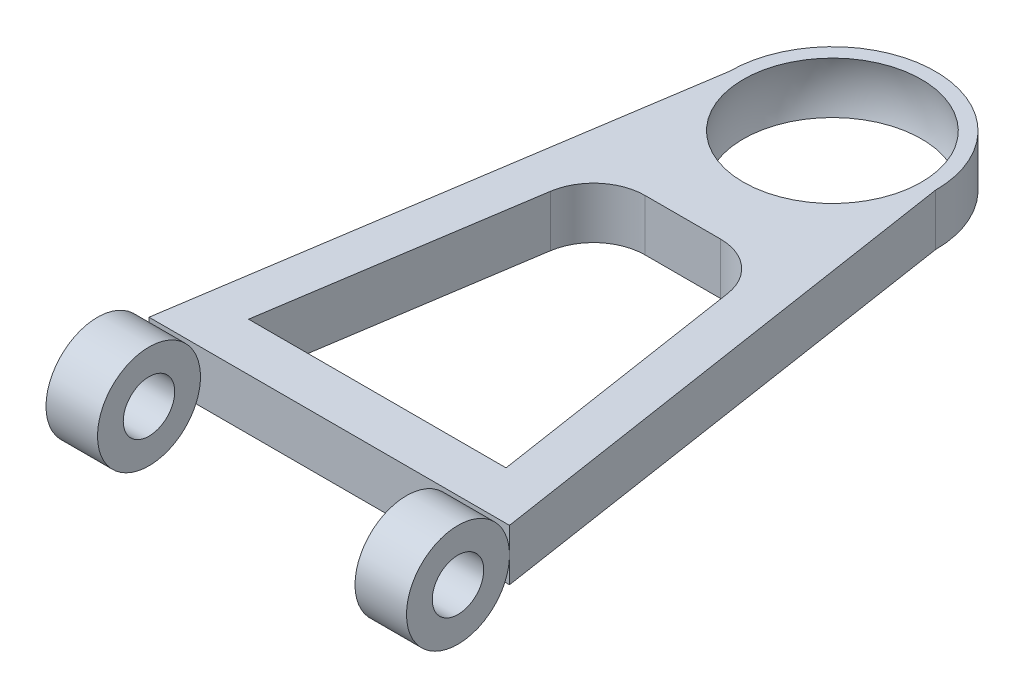
ISO-10303-21;
HEADER;
FILE_DESCRIPTION(('STEP AP214'),'2;1');
FILE_NAME('part.step','',(''),(''),'','','');
FILE_SCHEMA(('AUTOMOTIVE_DESIGN { 1 0 10303 214 1 1 1 1 }'));
ENDSEC;
DATA;
#1=APPLICATION_CONTEXT('core data for automotive mechanical design processes');
#2=APPLICATION_PROTOCOL_DEFINITION('international standard','automotive_design',2000,#1);
#3=PRODUCT_CONTEXT('',#1,'mechanical');
#4=PRODUCT('Part','Part','',(#3));
#5=PRODUCT_RELATED_PRODUCT_CATEGORY('part','',(#4));
#6=PRODUCT_DEFINITION_FORMATION('','',#4);
#7=PRODUCT_DEFINITION_CONTEXT('part definition',#1,'design');
#8=PRODUCT_DEFINITION('design','',#6,#7);
#9=PRODUCT_DEFINITION_SHAPE('','',#8);
#10=(LENGTH_UNIT() NAMED_UNIT(*) SI_UNIT(.MILLI.,.METRE.));
#11=(NAMED_UNIT(*) PLANE_ANGLE_UNIT() SI_UNIT($,.RADIAN.));
#12=(NAMED_UNIT(*) SI_UNIT($,.STERADIAN.) SOLID_ANGLE_UNIT());
#13=UNCERTAINTY_MEASURE_WITH_UNIT(LENGTH_MEASURE(1.E-05),#10,'distance_accuracy_value','');
#14=(GEOMETRIC_REPRESENTATION_CONTEXT(3) GLOBAL_UNCERTAINTY_ASSIGNED_CONTEXT((#13)) GLOBAL_UNIT_ASSIGNED_CONTEXT((#10,
#11,#12)) REPRESENTATION_CONTEXT('',''));
#15=CARTESIAN_POINT('',(0.,0.,0.));
#16=DIRECTION('',(0.,0.,1.));
#17=DIRECTION('',(1.,0.,0.));
#18=AXIS2_PLACEMENT_3D('',#15,#16,#17);
#19=CARTESIAN_POINT('',(35.,0.,0.));
#20=DIRECTION('',(-1.,0.,0.));
#21=DIRECTION('',(0.,0.,1.));
#22=AXIS2_PLACEMENT_3D('',#19,#20,#21);
#23=PLANE('',#22);
#24=CARTESIAN_POINT('',(35.,0.,10.));
#25=DIRECTION('',(1.,0.,0.));
#26=DIRECTION('',(0.,0.,-1.));
#27=AXIS2_PLACEMENT_3D('',#24,#25,#26);
#28=CIRCLE('',#27,5.);
#29=CARTESIAN_POINT('',(35.,0.,5.));
#30=VERTEX_POINT('',#29);
#31=EDGE_CURVE('E91',#30,#30,#28,.T.);
#32=ORIENTED_EDGE('',*,*,#31,.F.);
#33=EDGE_LOOP('',(#32));
#34=FACE_BOUND('',#33,.T.);
#35=CARTESIAN_POINT('',(35.,0.,10.));
#36=DIRECTION('',(-1.,0.,0.));
#37=DIRECTION('',(0.,0.,1.));
#38=AXIS2_PLACEMENT_3D('',#35,#36,#37);
#39=CIRCLE('',#38,10.);
#40=CARTESIAN_POINT('',(35.,0.,20.));
#41=VERTEX_POINT('',#40);
#42=EDGE_CURVE('E85',#41,#41,#39,.T.);
#43=ORIENTED_EDGE('',*,*,#42,.F.);
#44=EDGE_LOOP('',(#43));
#45=FACE_BOUND('',#44,.T.);
#46=ADVANCED_FACE('F78',(#34,#45),#23,.F.);
#47=CARTESIAN_POINT('',(25.,0.,0.));
#48=DIRECTION('',(1.,0.,0.));
#49=DIRECTION('',(0.,0.,-1.));
#50=AXIS2_PLACEMENT_3D('',#47,#48,#49);
#51=PLANE('',#50);
#52=CARTESIAN_POINT('',(25.,0.,10.));
#53=DIRECTION('',(1.,0.,0.));
#54=DIRECTION('',(0.,0.,-1.));
#55=AXIS2_PLACEMENT_3D('',#52,#53,#54);
#56=CIRCLE('',#55,5.);
#57=CARTESIAN_POINT('',(25.,0.,5.));
#58=VERTEX_POINT('',#57);
#59=EDGE_CURVE('E81',#58,#58,#56,.T.);
#60=ORIENTED_EDGE('',*,*,#59,.T.);
#61=EDGE_LOOP('',(#60));
#62=FACE_BOUND('',#61,.T.);
#63=CARTESIAN_POINT('',(25.,0.,10.));
#64=DIRECTION('',(-1.,0.,0.));
#65=DIRECTION('',(0.,0.,1.));
#66=AXIS2_PLACEMENT_3D('',#63,#64,#65);
#67=CIRCLE('',#66,10.);
#68=CARTESIAN_POINT('',(25.,0.,20.));
#69=VERTEX_POINT('',#68);
#70=EDGE_CURVE('E12',#69,#69,#67,.T.);
#71=ORIENTED_EDGE('',*,*,#70,.T.);
#72=EDGE_LOOP('',(#71));
#73=FACE_BOUND('',#72,.T.);
#74=ADVANCED_FACE('F98',(#62,#73),#51,.F.);
#75=CARTESIAN_POINT('',(-35.,0.,10.));
#76=DIRECTION('',(-1.,0.,0.));
#77=DIRECTION('',(0.,0.,1.));
#78=AXIS2_PLACEMENT_3D('',#75,#76,#77);
#79=CYLINDRICAL_SURFACE('',#78,10.);
#80=ORIENTED_EDGE('',*,*,#70,.F.);
#81=EDGE_LOOP('',(#80));
#82=FACE_BOUND('',#81,.T.);
#83=ORIENTED_EDGE('',*,*,#42,.T.);
#84=EDGE_LOOP('',(#83));
#85=FACE_BOUND('',#84,.T.);
#86=ADVANCED_FACE('F102',(#82,#85),#79,.T.);
#87=CARTESIAN_POINT('',(-63.,0.,10.));
#88=DIRECTION('',(1.,0.,0.));
#89=DIRECTION('',(0.,0.,-1.));
#90=AXIS2_PLACEMENT_3D('',#87,#88,#89);
#91=CYLINDRICAL_SURFACE('',#90,5.);
#92=ORIENTED_EDGE('',*,*,#31,.T.);
#93=EDGE_LOOP('',(#92));
#94=FACE_BOUND('',#93,.T.);
#95=ORIENTED_EDGE('',*,*,#59,.F.);
#96=EDGE_LOOP('',(#95));
#97=FACE_BOUND('',#96,.T.);
#98=ADVANCED_FACE('F100',(#94,#97),#91,.F.);
#99=CLOSED_SHELL('',(#46,#74,#86,#98));
#100=MANIFOLD_SOLID_BREP('B2',#99);
#101=CARTESIAN_POINT('',(-35.,0.,0.));
#102=DIRECTION('',(1.,0.,0.));
#103=DIRECTION('',(0.,0.,-1.));
#104=AXIS2_PLACEMENT_3D('',#101,#102,#103);
#105=PLANE('',#104);
#106=CARTESIAN_POINT('',(-35.,0.,10.));
#107=DIRECTION('',(1.,0.,0.));
#108=DIRECTION('',(0.,0.,-1.));
#109=AXIS2_PLACEMENT_3D('',#106,#107,#108);
#110=CIRCLE('',#109,5.);
#111=CARTESIAN_POINT('',(-35.,0.,5.));
#112=VERTEX_POINT('',#111);
#113=EDGE_CURVE('E160',#112,#112,#110,.T.);
#114=ORIENTED_EDGE('',*,*,#113,.T.);
#115=EDGE_LOOP('',(#114));
#116=FACE_BOUND('',#115,.T.);
#117=CARTESIAN_POINT('',(-35.,0.,10.));
#118=DIRECTION('',(-1.,0.,0.));
#119=DIRECTION('',(0.,0.,1.));
#120=AXIS2_PLACEMENT_3D('',#117,#118,#119);
#121=CIRCLE('',#120,10.);
#122=CARTESIAN_POINT('',(-35.,0.,20.));
#123=VERTEX_POINT('',#122);
#124=EDGE_CURVE('E156',#123,#123,#121,.T.);
#125=ORIENTED_EDGE('',*,*,#124,.T.);
#126=EDGE_LOOP('',(#125));
#127=FACE_BOUND('',#126,.T.);
#128=ADVANCED_FACE('F149',(#116,#127),#105,.F.);
#129=CARTESIAN_POINT('',(-25.,0.,0.));
#130=DIRECTION('',(-1.,0.,0.));
#131=DIRECTION('',(0.,0.,1.));
#132=AXIS2_PLACEMENT_3D('',#129,#130,#131);
#133=PLANE('',#132);
#134=CARTESIAN_POINT('',(-25.,0.,10.));
#135=DIRECTION('',(-1.,0.,0.));
#136=DIRECTION('',(0.,0.,1.));
#137=AXIS2_PLACEMENT_3D('',#134,#135,#136);
#138=CIRCLE('',#137,5.);
#139=CARTESIAN_POINT('',(-25.,0.,15.));
#140=VERTEX_POINT('',#139);
#141=EDGE_CURVE('E152',#140,#140,#138,.T.);
#142=ORIENTED_EDGE('',*,*,#141,.T.);
#143=EDGE_LOOP('',(#142));
#144=FACE_BOUND('',#143,.T.);
#145=CARTESIAN_POINT('',(-25.,0.,10.));
#146=DIRECTION('',(-1.,0.,0.));
#147=DIRECTION('',(0.,0.,1.));
#148=AXIS2_PLACEMENT_3D('',#145,#146,#147);
#149=CIRCLE('',#148,10.);
#150=CARTESIAN_POINT('',(-25.,0.,20.));
#151=VERTEX_POINT('',#150);
#152=EDGE_CURVE('E77',#151,#151,#149,.T.);
#153=ORIENTED_EDGE('',*,*,#152,.F.);
#154=EDGE_LOOP('',(#153));
#155=FACE_BOUND('',#154,.T.);
#156=ADVANCED_FACE('F169',(#144,#155),#133,.F.);
#157=CARTESIAN_POINT('',(-35.,0.,10.));
#158=DIRECTION('',(-1.,0.,0.));
#159=DIRECTION('',(0.,0.,1.));
#160=AXIS2_PLACEMENT_3D('',#157,#158,#159);
#161=CYLINDRICAL_SURFACE('',#160,10.);
#162=ORIENTED_EDGE('',*,*,#124,.F.);
#163=EDGE_LOOP('',(#162));
#164=FACE_BOUND('',#163,.T.);
#165=ORIENTED_EDGE('',*,*,#152,.T.);
#166=EDGE_LOOP('',(#165));
#167=FACE_BOUND('',#166,.T.);
#168=ADVANCED_FACE('F175',(#164,#167),#161,.T.);
#169=CARTESIAN_POINT('',(-63.,0.,10.));
#170=DIRECTION('',(1.,0.,0.));
#171=DIRECTION('',(0.,0.,-1.));
#172=AXIS2_PLACEMENT_3D('',#169,#170,#171);
#173=CYLINDRICAL_SURFACE('',#172,5.);
#174=ORIENTED_EDGE('',*,*,#141,.F.);
#175=EDGE_LOOP('',(#174));
#176=FACE_BOUND('',#175,.T.);
#177=ORIENTED_EDGE('',*,*,#113,.F.);
#178=EDGE_LOOP('',(#177));
#179=FACE_BOUND('',#178,.T.);
#180=ADVANCED_FACE('F172',(#176,#179),#173,.F.);
#181=CLOSED_SHELL('',(#128,#156,#168,#180));
#182=MANIFOLD_SOLID_BREP('B7',#181);
#183=CARTESIAN_POINT('',(0.,5.,0.));
#184=DIRECTION('',(0.,1.,0.));
#185=DIRECTION('',(0.,0.,1.));
#186=AXIS2_PLACEMENT_3D('',#183,#184,#185);
#187=PLANE('',#186);
#188=CARTESIAN_POINT('',(0.,5.,-97.7));
#189=DIRECTION('',(0.,1.,0.));
#190=DIRECTION('',(0.,0.,1.));
#191=AXIS2_PLACEMENT_3D('',#188,#189,#190);
#192=CIRCLE('',#191,17.2916164657906);
#193=CARTESIAN_POINT('',(0.,5.,-80.4083835342094));
#194=VERTEX_POINT('',#193);
#195=EDGE_CURVE('E303',#194,#194,#192,.F.);
#196=ORIENTED_EDGE('',*,*,#195,.T.);
#197=EDGE_LOOP('',(#196));
#198=FACE_BOUND('',#197,.T.);
#199=DIRECTION('',(-0.151753086094574,0.,0.988418434095992));
#200=VECTOR('',#199,1.);
#201=CARTESIAN_POINT('',(-25.,5.,-9.33231707317077));
#202=LINE('',#201,#200);
#203=CARTESIAN_POINT('',(-17.1971386530135,5.,-60.154953979876));
#204=VERTEX_POINT('',#203);
#205=CARTESIAN_POINT('',(-25.,5.,-9.33231707317077));
#206=VERTEX_POINT('',#205);
#207=EDGE_CURVE('E226',#204,#206,#202,.T.);
#208=ORIENTED_EDGE('',*,*,#207,.F.);
#209=CARTESIAN_POINT('',(-7.31295431205361,5.,-58.6374231189303));
#210=DIRECTION('',(0.,1.,0.));
#211=DIRECTION('',(0.,0.,-1.));
#212=AXIS2_PLACEMENT_3D('',#209,#210,#211);
#213=CIRCLE('',#212,10.);
#214=CARTESIAN_POINT('',(-7.31295431205355,5.,-68.6374231189303));
#215=VERTEX_POINT('',#214);
#216=EDGE_CURVE('E316',#215,#204,#213,.T.);
#217=ORIENTED_EDGE('',*,*,#216,.F.);
#218=DIRECTION('',(-1.,0.,0.));
#219=VECTOR('',#218,1.);
#220=CARTESIAN_POINT('',(-7.31295431205355,5.,-68.6374231189303));
#221=LINE('',#220,#219);
#222=CARTESIAN_POINT('',(7.31295431205354,5.,-68.6374231189303));
#223=VERTEX_POINT('',#222);
#224=EDGE_CURVE('E310',#223,#215,#221,.T.);
#225=ORIENTED_EDGE('',*,*,#224,.F.);
#226=CARTESIAN_POINT('',(7.3129543120536,5.,-58.6374231189303));
#227=DIRECTION('',(0.,1.,0.));
#228=DIRECTION('',(0.,0.,1.));
#229=AXIS2_PLACEMENT_3D('',#226,#227,#228);
#230=CIRCLE('',#229,10.);
#231=CARTESIAN_POINT('',(17.1971386530135,5.,-60.154953979876));
#232=VERTEX_POINT('',#231);
#233=EDGE_CURVE('E308',#232,#223,#230,.T.);
#234=ORIENTED_EDGE('',*,*,#233,.F.);
#235=DIRECTION('',(-0.151753086094574,0.,-0.988418434095992));
#236=VECTOR('',#235,1.);
#237=CARTESIAN_POINT('',(25.,5.,-9.33231707317077));
#238=LINE('',#237,#236);
#239=CARTESIAN_POINT('',(25.,5.,-9.33231707317077));
#240=VERTEX_POINT('',#239);
#241=EDGE_CURVE('E291',#240,#232,#238,.T.);
#242=ORIENTED_EDGE('',*,*,#241,.F.);
#243=DIRECTION('',(1.,0.,0.));
#244=VECTOR('',#243,1.);
#245=CARTESIAN_POINT('',(0.,5.,-9.33231707317077));
#246=LINE('',#245,#244);
#247=EDGE_CURVE('E299',#206,#240,#246,.T.);
#248=ORIENTED_EDGE('',*,*,#247,.F.);
#249=EDGE_LOOP('',(#208,#217,#225,#234,#242,#248));
#250=FACE_BOUND('',#249,.T.);
#251=DIRECTION('',(-0.151753086094574,0.,-0.988418434095992));
#252=VECTOR('',#251,1.);
#253=CARTESIAN_POINT('',(34.1939850301271,5.,-5.24984417043916));
#254=LINE('',#253,#252);
#255=CARTESIAN_POINT('',(35.,5.,0.));
#256=VERTEX_POINT('',#255);
#257=CARTESIAN_POINT('',(20.,5.,-97.7));
#258=VERTEX_POINT('',#257);
#259=EDGE_CURVE('E340',#256,#258,#254,.T.);
#260=ORIENTED_EDGE('',*,*,#259,.T.);
#261=CARTESIAN_POINT('',(0.,5.,-97.7));
#262=DIRECTION('',(0.,1.,0.));
#263=DIRECTION('',(0.,0.,1.));
#264=AXIS2_PLACEMENT_3D('',#261,#262,#263);
#265=CIRCLE('',#264,20.);
#266=CARTESIAN_POINT('',(-20.,5.,-97.7));
#267=VERTEX_POINT('',#266);
#268=EDGE_CURVE('E331',#258,#267,#265,.T.);
#269=ORIENTED_EDGE('',*,*,#268,.T.);
#270=DIRECTION('',(0.151753086094574,0.,-0.988418434095992));
#271=VECTOR('',#270,1.);
#272=CARTESIAN_POINT('',(-34.1939850301271,5.,-5.24984417043916));
#273=LINE('',#272,#271);
#274=CARTESIAN_POINT('',(-35.,5.,0.));
#275=VERTEX_POINT('',#274);
#276=EDGE_CURVE('E334',#275,#267,#273,.T.);
#277=ORIENTED_EDGE('',*,*,#276,.F.);
#278=DIRECTION('',(1.,0.,0.));
#279=VECTOR('',#278,1.);
#280=CARTESIAN_POINT('',(0.,5.,0.));
#281=LINE('',#280,#279);
#282=EDGE_CURVE('E337',#275,#256,#281,.T.);
#283=ORIENTED_EDGE('',*,*,#282,.T.);
#284=EDGE_LOOP('',(#260,#269,#277,#283));
#285=FACE_BOUND('',#284,.T.);
#286=ADVANCED_FACE('F210',(#198,#250,#285),#187,.T.);
#287=CARTESIAN_POINT('',(0.,5.,-97.7));
#288=DIRECTION('',(0.,-1.,0.));
#289=DIRECTION('',(0.,0.,-1.));
#290=AXIS2_PLACEMENT_3D('',#287,#288,#289);
#291=CYLINDRICAL_SURFACE('',#290,20.);
#292=DIRECTION('',(0.,1.,0.));
#293=VECTOR('',#292,1.);
#294=CARTESIAN_POINT('',(20.,-5.,-97.7));
#295=LINE('',#294,#293);
#296=CARTESIAN_POINT('',(20.,-5.,-97.7));
#297=VERTEX_POINT('',#296);
#298=EDGE_CURVE('E351',#297,#258,#295,.T.);
#299=ORIENTED_EDGE('',*,*,#298,.F.);
#300=CARTESIAN_POINT('',(0.,-5.,-97.7));
#301=DIRECTION('',(0.,1.,0.));
#302=DIRECTION('',(0.,0.,1.));
#303=AXIS2_PLACEMENT_3D('',#300,#301,#302);
#304=CIRCLE('',#303,20.);
#305=CARTESIAN_POINT('',(-20.,-5.,-97.7));
#306=VERTEX_POINT('',#305);
#307=EDGE_CURVE('E321',#297,#306,#304,.T.);
#308=ORIENTED_EDGE('',*,*,#307,.T.);
#309=DIRECTION('',(0.,1.,0.));
#310=VECTOR('',#309,1.);
#311=CARTESIAN_POINT('',(-20.,-5.,-97.7));
#312=LINE('',#311,#310);
#313=EDGE_CURVE('E350',#306,#267,#312,.T.);
#314=ORIENTED_EDGE('',*,*,#313,.T.);
#315=ORIENTED_EDGE('',*,*,#268,.F.);
#316=EDGE_LOOP('',(#299,#308,#314,#315));
#317=FACE_BOUND('',#316,.T.);
#318=ADVANCED_FACE('F393',(#317),#291,.T.);
#319=CARTESIAN_POINT('',(34.1939850301271,-5.,-5.24984417043916));
#320=DIRECTION('',(0.988418434095992,0.,-0.151753086094574));
#321=DIRECTION('',(-0.151753086094574,0.,-0.988418434095992));
#322=AXIS2_PLACEMENT_3D('',#319,#320,#321);
#323=PLANE('',#322);
#324=ORIENTED_EDGE('',*,*,#298,.T.);
#325=ORIENTED_EDGE('',*,*,#259,.F.);
#326=DIRECTION('',(0.,1.,0.));
#327=VECTOR('',#326,1.);
#328=CARTESIAN_POINT('',(35.,-5.,0.));
#329=LINE('',#328,#327);
#330=CARTESIAN_POINT('',(35.,-5.,0.));
#331=VERTEX_POINT('',#330);
#332=EDGE_CURVE('E354',#331,#256,#329,.T.);
#333=ORIENTED_EDGE('',*,*,#332,.F.);
#334=DIRECTION('',(-0.151753086094574,0.,-0.988418434095992));
#335=VECTOR('',#334,1.);
#336=CARTESIAN_POINT('',(34.1939850301271,-5.,-5.24984417043916));
#337=LINE('',#336,#335);
#338=EDGE_CURVE('E348',#331,#297,#337,.T.);
#339=ORIENTED_EDGE('',*,*,#338,.T.);
#340=EDGE_LOOP('',(#324,#325,#333,#339));
#341=FACE_BOUND('',#340,.T.);
#342=ADVANCED_FACE('F399',(#341),#323,.T.);
#343=CARTESIAN_POINT('',(0.,-5.,0.));
#344=DIRECTION('',(0.,0.,1.));
#345=DIRECTION('',(1.,0.,0.));
#346=AXIS2_PLACEMENT_3D('',#343,#344,#345);
#347=PLANE('',#346);
#348=ORIENTED_EDGE('',*,*,#332,.T.);
#349=ORIENTED_EDGE('',*,*,#282,.F.);
#350=DIRECTION('',(0.,1.,0.));
#351=VECTOR('',#350,1.);
#352=CARTESIAN_POINT('',(-35.,-5.,0.));
#353=LINE('',#352,#351);
#354=CARTESIAN_POINT('',(-35.,-5.,0.));
#355=VERTEX_POINT('',#354);
#356=EDGE_CURVE('E356',#355,#275,#353,.T.);
#357=ORIENTED_EDGE('',*,*,#356,.F.);
#358=DIRECTION('',(1.,0.,0.));
#359=VECTOR('',#358,1.);
#360=CARTESIAN_POINT('',(0.,-5.,0.));
#361=LINE('',#360,#359);
#362=EDGE_CURVE('E345',#355,#331,#361,.T.);
#363=ORIENTED_EDGE('',*,*,#362,.T.);
#364=EDGE_LOOP('',(#348,#349,#357,#363));
#365=FACE_BOUND('',#364,.T.);
#366=ADVANCED_FACE('F406',(#365),#347,.T.);
#367=CARTESIAN_POINT('',(-34.1939850301271,-5.,-5.24984417043916));
#368=DIRECTION('',(0.988418434095992,0.,0.151753086094574));
#369=DIRECTION('',(0.151753086094574,0.,-0.988418434095992));
#370=AXIS2_PLACEMENT_3D('',#367,#368,#369);
#371=PLANE('',#370);
#372=ORIENTED_EDGE('',*,*,#356,.T.);
#373=ORIENTED_EDGE('',*,*,#276,.T.);
#374=ORIENTED_EDGE('',*,*,#313,.F.);
#375=DIRECTION('',(0.151753086094574,0.,-0.988418434095992));
#376=VECTOR('',#375,1.);
#377=CARTESIAN_POINT('',(-34.1939850301271,-5.,-5.24984417043916));
#378=LINE('',#377,#376);
#379=EDGE_CURVE('E343',#355,#306,#378,.T.);
#380=ORIENTED_EDGE('',*,*,#379,.F.);
#381=EDGE_LOOP('',(#372,#373,#374,#380));
#382=FACE_BOUND('',#381,.T.);
#383=ADVANCED_FACE('F212',(#382),#371,.F.);
#384=CARTESIAN_POINT('',(0.,-5.,0.));
#385=DIRECTION('',(0.,1.,0.));
#386=DIRECTION('',(0.,0.,1.));
#387=AXIS2_PLACEMENT_3D('',#384,#385,#386);
#388=PLANE('',#387);
#389=CARTESIAN_POINT('',(0.,-5.,-97.7));
#390=DIRECTION('',(0.,1.,0.));
#391=DIRECTION('',(0.,0.,1.));
#392=AXIS2_PLACEMENT_3D('',#389,#390,#391);
#393=CIRCLE('',#392,17.2916164657906);
#394=CARTESIAN_POINT('',(0.,-5.,-80.4083835342094));
#395=VERTEX_POINT('',#394);
#396=EDGE_CURVE('E214',#395,#395,#393,.F.);
#397=ORIENTED_EDGE('',*,*,#396,.F.);
#398=EDGE_LOOP('',(#397));
#399=FACE_BOUND('',#398,.T.);
#400=CARTESIAN_POINT('',(-7.31295431205361,-5.,-58.6374231189303));
#401=DIRECTION('',(0.,1.,0.));
#402=DIRECTION('',(0.,0.,1.));
#403=AXIS2_PLACEMENT_3D('',#400,#401,#402);
#404=CIRCLE('',#403,10.);
#405=CARTESIAN_POINT('',(-7.31295431205355,-5.,-68.6374231189303));
#406=VERTEX_POINT('',#405);
#407=CARTESIAN_POINT('',(-17.1971386530135,-5.,-60.154953979876));
#408=VERTEX_POINT('',#407);
#409=EDGE_CURVE('E219',#406,#408,#404,.T.);
#410=ORIENTED_EDGE('',*,*,#409,.T.);
#411=DIRECTION('',(-0.151753086094574,0.,0.988418434095992));
#412=VECTOR('',#411,1.);
#413=CARTESIAN_POINT('',(-25.82408103247,-5.,-3.96480261501587));
#414=LINE('',#413,#412);
#415=CARTESIAN_POINT('',(-25.,-5.,-9.33231707317077));
#416=VERTEX_POINT('',#415);
#417=EDGE_CURVE('E147',#408,#416,#414,.T.);
#418=ORIENTED_EDGE('',*,*,#417,.T.);
#419=DIRECTION('',(1.,0.,0.));
#420=VECTOR('',#419,1.);
#421=CARTESIAN_POINT('',(0.,-5.,-9.33231707317077));
#422=LINE('',#421,#420);
#423=CARTESIAN_POINT('',(25.,-5.,-9.33231707317077));
#424=VERTEX_POINT('',#423);
#425=EDGE_CURVE('E353',#416,#424,#422,.T.);
#426=ORIENTED_EDGE('',*,*,#425,.T.);
#427=DIRECTION('',(-0.151753086094574,0.,-0.988418434095992));
#428=VECTOR('',#427,1.);
#429=CARTESIAN_POINT('',(25.8240810324701,-5.,-3.96480261501587));
#430=LINE('',#429,#428);
#431=CARTESIAN_POINT('',(17.1971386530135,-5.,-60.154953979876));
#432=VERTEX_POINT('',#431);
#433=EDGE_CURVE('E294',#424,#432,#430,.T.);
#434=ORIENTED_EDGE('',*,*,#433,.T.);
#435=CARTESIAN_POINT('',(7.3129543120536,-5.,-58.6374231189303));
#436=DIRECTION('',(0.,1.,0.));
#437=DIRECTION('',(0.,0.,1.));
#438=AXIS2_PLACEMENT_3D('',#435,#436,#437);
#439=CIRCLE('',#438,10.);
#440=CARTESIAN_POINT('',(7.31295431205354,-5.,-68.6374231189303));
#441=VERTEX_POINT('',#440);
#442=EDGE_CURVE('E361',#432,#441,#439,.T.);
#443=ORIENTED_EDGE('',*,*,#442,.T.);
#444=DIRECTION('',(-1.,0.,0.));
#445=VECTOR('',#444,1.);
#446=CARTESIAN_POINT('',(0.,-5.,-68.6374231189303));
#447=LINE('',#446,#445);
#448=EDGE_CURVE('E364',#441,#406,#447,.T.);
#449=ORIENTED_EDGE('',*,*,#448,.T.);
#450=EDGE_LOOP('',(#410,#418,#426,#434,#443,#449));
#451=FACE_BOUND('',#450,.T.);
#452=ORIENTED_EDGE('',*,*,#379,.T.);
#453=ORIENTED_EDGE('',*,*,#307,.F.);
#454=ORIENTED_EDGE('',*,*,#338,.F.);
#455=ORIENTED_EDGE('',*,*,#362,.F.);
#456=EDGE_LOOP('',(#452,#453,#454,#455));
#457=FACE_BOUND('',#456,.T.);
#458=ADVANCED_FACE('F369',(#399,#451,#457),#388,.F.);
#459=CARTESIAN_POINT('',(-25.,-93.,-9.33231707317077));
#460=DIRECTION('',(-0.988418434095992,0.,-0.151753086094574));
#461=DIRECTION('',(-0.151753086094574,0.,0.988418434095992));
#462=AXIS2_PLACEMENT_3D('',#459,#460,#461);
#463=PLANE('',#462);
#464=DIRECTION('',(0.,1.,0.));
#465=VECTOR('',#464,1.);
#466=CARTESIAN_POINT('',(-17.1971386530135,-93.,-60.154953979876));
#467=LINE('',#466,#465);
#468=EDGE_CURVE('E322',#408,#204,#467,.T.);
#469=ORIENTED_EDGE('',*,*,#468,.T.);
#470=ORIENTED_EDGE('',*,*,#207,.T.);
#471=DIRECTION('',(0.,1.,0.));
#472=VECTOR('',#471,1.);
#473=CARTESIAN_POINT('',(-25.,-93.,-9.33231707317077));
#474=LINE('',#473,#472);
#475=EDGE_CURVE('E301',#416,#206,#474,.T.);
#476=ORIENTED_EDGE('',*,*,#475,.F.);
#477=ORIENTED_EDGE('',*,*,#417,.F.);
#478=EDGE_LOOP('',(#469,#470,#476,#477));
#479=FACE_BOUND('',#478,.T.);
#480=ADVANCED_FACE('F381',(#479),#463,.F.);
#481=CARTESIAN_POINT('',(-7.31295431205361,-93.,-58.6374231189303));
#482=DIRECTION('',(0.,1.,0.));
#483=DIRECTION('',(0.,0.,1.));
#484=AXIS2_PLACEMENT_3D('',#481,#482,#483);
#485=CYLINDRICAL_SURFACE('',#484,10.);
#486=DIRECTION('',(0.,1.,0.));
#487=VECTOR('',#486,1.);
#488=CARTESIAN_POINT('',(-7.31295431205355,-93.,-68.6374231189303));
#489=LINE('',#488,#487);
#490=EDGE_CURVE('E324',#406,#215,#489,.T.);
#491=ORIENTED_EDGE('',*,*,#490,.T.);
#492=ORIENTED_EDGE('',*,*,#216,.T.);
#493=ORIENTED_EDGE('',*,*,#468,.F.);
#494=ORIENTED_EDGE('',*,*,#409,.F.);
#495=EDGE_LOOP('',(#491,#492,#493,#494));
#496=FACE_BOUND('',#495,.T.);
#497=ADVANCED_FACE('F374',(#496),#485,.F.);
#498=CARTESIAN_POINT('',(-7.31295431205355,-93.,-68.6374231189303));
#499=DIRECTION('',(0.,0.,-1.));
#500=DIRECTION('',(-1.,0.,0.));
#501=AXIS2_PLACEMENT_3D('',#498,#499,#500);
#502=PLANE('',#501);
#503=DIRECTION('',(0.,1.,0.));
#504=VECTOR('',#503,1.);
#505=CARTESIAN_POINT('',(7.31295431205354,-93.,-68.6374231189303));
#506=LINE('',#505,#504);
#507=EDGE_CURVE('E326',#441,#223,#506,.T.);
#508=ORIENTED_EDGE('',*,*,#507,.T.);
#509=ORIENTED_EDGE('',*,*,#224,.T.);
#510=ORIENTED_EDGE('',*,*,#490,.F.);
#511=ORIENTED_EDGE('',*,*,#448,.F.);
#512=EDGE_LOOP('',(#508,#509,#510,#511));
#513=FACE_BOUND('',#512,.T.);
#514=ADVANCED_FACE('F376',(#513),#502,.F.);
#515=CARTESIAN_POINT('',(7.3129543120536,-93.,-58.6374231189303));
#516=DIRECTION('',(0.,1.,0.));
#517=DIRECTION('',(0.,0.,1.));
#518=AXIS2_PLACEMENT_3D('',#515,#516,#517);
#519=CYLINDRICAL_SURFACE('',#518,10.);
#520=DIRECTION('',(0.,1.,0.));
#521=VECTOR('',#520,1.);
#522=CARTESIAN_POINT('',(17.1971386530135,-93.,-60.154953979876));
#523=LINE('',#522,#521);
#524=EDGE_CURVE('E296',#432,#232,#523,.T.);
#525=ORIENTED_EDGE('',*,*,#524,.T.);
#526=ORIENTED_EDGE('',*,*,#233,.T.);
#527=ORIENTED_EDGE('',*,*,#507,.F.);
#528=ORIENTED_EDGE('',*,*,#442,.F.);
#529=EDGE_LOOP('',(#525,#526,#527,#528));
#530=FACE_BOUND('',#529,.T.);
#531=ADVANCED_FACE('F380',(#530),#519,.F.);
#532=CARTESIAN_POINT('',(25.,-93.,-9.33231707317077));
#533=DIRECTION('',(0.988418434095992,0.,-0.151753086094574));
#534=DIRECTION('',(-0.151753086094574,0.,-0.988418434095992));
#535=AXIS2_PLACEMENT_3D('',#532,#533,#534);
#536=PLANE('',#535);
#537=DIRECTION('',(0.,1.,0.));
#538=VECTOR('',#537,1.);
#539=CARTESIAN_POINT('',(25.,-93.,-9.33231707317077));
#540=LINE('',#539,#538);
#541=EDGE_CURVE('E234',#424,#240,#540,.T.);
#542=ORIENTED_EDGE('',*,*,#541,.T.);
#543=ORIENTED_EDGE('',*,*,#241,.T.);
#544=ORIENTED_EDGE('',*,*,#524,.F.);
#545=ORIENTED_EDGE('',*,*,#433,.F.);
#546=EDGE_LOOP('',(#542,#543,#544,#545));
#547=FACE_BOUND('',#546,.T.);
#548=ADVANCED_FACE('F288',(#547),#536,.F.);
#549=CARTESIAN_POINT('',(0.,-93.,-9.33231707317077));
#550=DIRECTION('',(0.,0.,1.));
#551=DIRECTION('',(1.,0.,0.));
#552=AXIS2_PLACEMENT_3D('',#549,#550,#551);
#553=PLANE('',#552);
#554=ORIENTED_EDGE('',*,*,#475,.T.);
#555=ORIENTED_EDGE('',*,*,#247,.T.);
#556=ORIENTED_EDGE('',*,*,#541,.F.);
#557=ORIENTED_EDGE('',*,*,#425,.F.);
#558=EDGE_LOOP('',(#554,#555,#556,#557));
#559=FACE_BOUND('',#558,.T.);
#560=ADVANCED_FACE('F300',(#559),#553,.F.);
#561=CARTESIAN_POINT('',(0.,0.,-97.7));
#562=DIRECTION('',(-1.,0.,0.));
#563=DIRECTION('',(0.,0.,-1.));
#564=AXIS2_PLACEMENT_3D('',#561,#562,#563);
#565=SPHERICAL_SURFACE('',#564,18.);
#566=CARTESIAN_POINT('',(0.,0.,-97.7));
#567=DIRECTION('',(0.,1.,0.));
#568=DIRECTION('',(0.,0.,1.));
#569=AXIS2_PLACEMENT_3D('',#566,#567,#568);
#570=SPHERICAL_SURFACE('',#569,18.);
#571=ORIENTED_EDGE('',*,*,#195,.F.);
#572=EDGE_LOOP('',(#571));
#573=FACE_BOUND('',#572,.T.);
#574=ORIENTED_EDGE('',*,*,#396,.T.);
#575=EDGE_LOOP('',(#574));
#576=FACE_BOUND('',#575,.T.);
#577=ADVANCED_FACE('F440',(#573,#576),#570,.F.);
#578=CLOSED_SHELL('',(#286,#318,#342,#366,#383,#458,#480,#497,#514,#531,#548,#560,#577));
#579=MANIFOLD_SOLID_BREP('B72',#578);
#580=ADVANCED_BREP_SHAPE_REPRESENTATION('',(#18,#100,#182,#579),#14);
#581=SHAPE_DEFINITION_REPRESENTATION(#9,#580);
ENDSEC;
END-ISO-10303-21;
